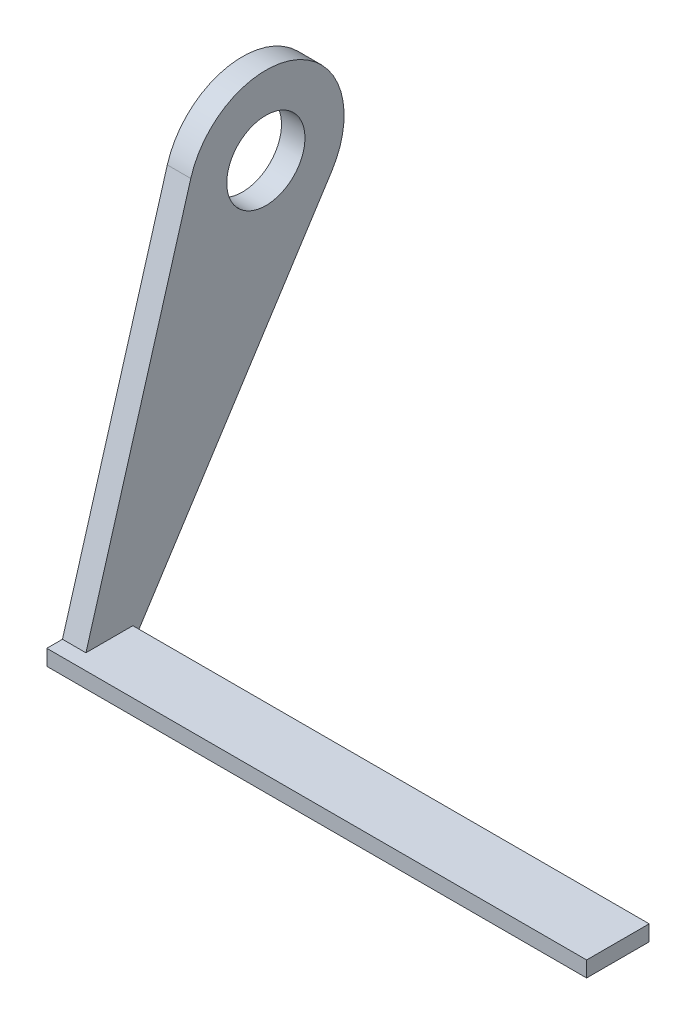
ISO-10303-21;
HEADER;
FILE_DESCRIPTION(('STEP AP214'),'2;1');
FILE_NAME('part.step','',(''),(''),'','','');
FILE_SCHEMA(('AUTOMOTIVE_DESIGN { 1 0 10303 214 1 1 1 1 }'));
ENDSEC;
DATA;
#1=APPLICATION_CONTEXT('core data for automotive mechanical design processes');
#2=APPLICATION_PROTOCOL_DEFINITION('international standard','automotive_design',2000,#1);
#3=PRODUCT_CONTEXT('',#1,'mechanical');
#4=PRODUCT('Part','Part','',(#3));
#5=PRODUCT_RELATED_PRODUCT_CATEGORY('part','',(#4));
#6=PRODUCT_DEFINITION_FORMATION('','',#4);
#7=PRODUCT_DEFINITION_CONTEXT('part definition',#1,'design');
#8=PRODUCT_DEFINITION('design','',#6,#7);
#9=PRODUCT_DEFINITION_SHAPE('','',#8);
#10=(LENGTH_UNIT() NAMED_UNIT(*) SI_UNIT(.MILLI.,.METRE.));
#11=(NAMED_UNIT(*) PLANE_ANGLE_UNIT() SI_UNIT($,.RADIAN.));
#12=(NAMED_UNIT(*) SI_UNIT($,.STERADIAN.) SOLID_ANGLE_UNIT());
#13=UNCERTAINTY_MEASURE_WITH_UNIT(LENGTH_MEASURE(1.E-05),#10,'distance_accuracy_value','');
#14=(GEOMETRIC_REPRESENTATION_CONTEXT(3) GLOBAL_UNCERTAINTY_ASSIGNED_CONTEXT((#13)) GLOBAL_UNIT_ASSIGNED_CONTEXT((#10,
#11,#12)) REPRESENTATION_CONTEXT('',''));
#15=CARTESIAN_POINT('',(0.,0.,0.));
#16=DIRECTION('',(0.,0.,1.));
#17=DIRECTION('',(1.,0.,0.));
#18=AXIS2_PLACEMENT_3D('',#15,#16,#17);
#19=CARTESIAN_POINT('',(17.526,-10.922,0.));
#20=DIRECTION('',(0.,1.,0.));
#21=DIRECTION('',(0.,0.,1.));
#22=AXIS2_PLACEMENT_3D('',#19,#20,#21);
#23=PLANE('',#22);
#24=DIRECTION('',(0.,0.,-1.));
#25=VECTOR('',#24,1.);
#26=CARTESIAN_POINT('',(0.762,-10.922,0.));
#27=LINE('',#26,#25);
#28=CARTESIAN_POINT('',(0.762,-10.922,5.842));
#29=VERTEX_POINT('',#28);
#30=CARTESIAN_POINT('',(0.762,-10.922,4.318));
#31=VERTEX_POINT('',#30);
#32=EDGE_CURVE('E135',#29,#31,#27,.T.);
#33=ORIENTED_EDGE('',*,*,#32,.F.);
#34=DIRECTION('',(-1.,0.,0.));
#35=VECTOR('',#34,1.);
#36=CARTESIAN_POINT('',(0.762,-10.922,5.842));
#37=LINE('',#36,#35);
#38=CARTESIAN_POINT('',(0.,-10.922,5.842));
#39=VERTEX_POINT('',#38);
#40=EDGE_CURVE('E147',#29,#39,#37,.T.);
#41=ORIENTED_EDGE('',*,*,#40,.T.);
#42=DIRECTION('',(0.,0.,-1.));
#43=VECTOR('',#42,1.);
#44=CARTESIAN_POINT('',(0.,-10.922,0.));
#45=LINE('',#44,#43);
#46=CARTESIAN_POINT('',(0.,-10.922,6.35));
#47=VERTEX_POINT('',#46);
#48=EDGE_CURVE('E114',#47,#39,#45,.T.);
#49=ORIENTED_EDGE('',*,*,#48,.F.);
#50=DIRECTION('',(-1.,0.,0.));
#51=VECTOR('',#50,1.);
#52=CARTESIAN_POINT('',(17.526,-10.922,6.35));
#53=LINE('',#52,#51);
#54=CARTESIAN_POINT('',(17.526,-10.922,6.35));
#55=VERTEX_POINT('',#54);
#56=EDGE_CURVE('E44',#55,#47,#53,.T.);
#57=ORIENTED_EDGE('',*,*,#56,.F.);
#58=DIRECTION('',(0.,0.,-1.));
#59=VECTOR('',#58,1.);
#60=CARTESIAN_POINT('',(17.526,-10.922,0.));
#61=LINE('',#60,#59);
#62=CARTESIAN_POINT('',(17.526,-10.922,4.318));
#63=VERTEX_POINT('',#62);
#64=EDGE_CURVE('E153',#55,#63,#61,.T.);
#65=ORIENTED_EDGE('',*,*,#64,.T.);
#66=DIRECTION('',(-1.,0.,0.));
#67=VECTOR('',#66,1.);
#68=CARTESIAN_POINT('',(17.526,-10.922,4.318));
#69=LINE('',#68,#67);
#70=EDGE_CURVE('E11',#63,#31,#69,.T.);
#71=ORIENTED_EDGE('',*,*,#70,.T.);
#72=EDGE_LOOP('',(#33,#41,#49,#57,#65,#71));
#73=FACE_BOUND('',#72,.T.);
#74=ADVANCED_FACE('F35',(#73),#23,.T.);
#75=CARTESIAN_POINT('',(17.526,0.,4.318));
#76=DIRECTION('',(0.,0.,-1.));
#77=DIRECTION('',(-1.,0.,0.));
#78=AXIS2_PLACEMENT_3D('',#75,#76,#77);
#79=PLANE('',#78);
#80=DIRECTION('',(0.,-1.,0.));
#81=VECTOR('',#80,1.);
#82=CARTESIAN_POINT('',(0.762,0.,4.318));
#83=LINE('',#82,#81);
#84=CARTESIAN_POINT('',(0.762,-11.43,4.318));
#85=VERTEX_POINT('',#84);
#86=EDGE_CURVE('E127',#31,#85,#83,.T.);
#87=ORIENTED_EDGE('',*,*,#86,.F.);
#88=ORIENTED_EDGE('',*,*,#70,.F.);
#89=DIRECTION('',(0.,-1.,0.));
#90=VECTOR('',#89,1.);
#91=CARTESIAN_POINT('',(17.526,0.,4.318));
#92=LINE('',#91,#90);
#93=CARTESIAN_POINT('',(17.526,-11.43,4.318));
#94=VERTEX_POINT('',#93);
#95=EDGE_CURVE('E151',#63,#94,#92,.T.);
#96=ORIENTED_EDGE('',*,*,#95,.T.);
#97=DIRECTION('',(-1.,0.,0.));
#98=VECTOR('',#97,1.);
#99=CARTESIAN_POINT('',(17.526,-11.43,4.318));
#100=LINE('',#99,#98);
#101=EDGE_CURVE('E160',#94,#85,#100,.T.);
#102=ORIENTED_EDGE('',*,*,#101,.T.);
#103=EDGE_LOOP('',(#87,#88,#96,#102));
#104=FACE_BOUND('',#103,.T.);
#105=ADVANCED_FACE('F37',(#104),#79,.T.);
#106=CARTESIAN_POINT('',(17.526,0.,6.35));
#107=DIRECTION('',(0.,0.,-1.));
#108=DIRECTION('',(-1.,0.,0.));
#109=AXIS2_PLACEMENT_3D('',#106,#107,#108);
#110=PLANE('',#109);
#111=DIRECTION('',(0.,-1.,0.));
#112=VECTOR('',#111,1.);
#113=CARTESIAN_POINT('',(0.,0.,6.35));
#114=LINE('',#113,#112);
#115=CARTESIAN_POINT('',(0.,-11.43,6.35));
#116=VERTEX_POINT('',#115);
#117=EDGE_CURVE('E66',#47,#116,#114,.T.);
#118=ORIENTED_EDGE('',*,*,#117,.T.);
#119=DIRECTION('',(-1.,0.,0.));
#120=VECTOR('',#119,1.);
#121=CARTESIAN_POINT('',(17.526,-11.43,6.35));
#122=LINE('',#121,#120);
#123=CARTESIAN_POINT('',(17.526,-11.43,6.35));
#124=VERTEX_POINT('',#123);
#125=EDGE_CURVE('E168',#124,#116,#122,.T.);
#126=ORIENTED_EDGE('',*,*,#125,.F.);
#127=DIRECTION('',(0.,-1.,0.));
#128=VECTOR('',#127,1.);
#129=CARTESIAN_POINT('',(17.526,0.,6.35));
#130=LINE('',#129,#128);
#131=EDGE_CURVE('E157',#55,#124,#130,.T.);
#132=ORIENTED_EDGE('',*,*,#131,.F.);
#133=ORIENTED_EDGE('',*,*,#56,.T.);
#134=EDGE_LOOP('',(#118,#126,#132,#133));
#135=FACE_BOUND('',#134,.T.);
#136=ADVANCED_FACE('F170',(#135),#110,.F.);
#137=CARTESIAN_POINT('',(17.526,-11.43,0.));
#138=DIRECTION('',(0.,1.,0.));
#139=DIRECTION('',(0.,0.,1.));
#140=AXIS2_PLACEMENT_3D('',#137,#138,#139);
#141=PLANE('',#140);
#142=DIRECTION('',(0.,0.,-1.));
#143=VECTOR('',#142,1.);
#144=CARTESIAN_POINT('',(0.,-11.43,0.));
#145=LINE('',#144,#143);
#146=CARTESIAN_POINT('',(0.,-11.43,4.318));
#147=VERTEX_POINT('',#146);
#148=EDGE_CURVE('E154',#116,#147,#145,.T.);
#149=ORIENTED_EDGE('',*,*,#148,.T.);
#150=DIRECTION('',(-1.,0.,0.));
#151=VECTOR('',#150,1.);
#152=CARTESIAN_POINT('',(0.762,-11.43,4.318));
#153=LINE('',#152,#151);
#154=EDGE_CURVE('E141',#85,#147,#153,.T.);
#155=ORIENTED_EDGE('',*,*,#154,.F.);
#156=ORIENTED_EDGE('',*,*,#101,.F.);
#157=DIRECTION('',(0.,0.,-1.));
#158=VECTOR('',#157,1.);
#159=CARTESIAN_POINT('',(17.526,-11.43,0.));
#160=LINE('',#159,#158);
#161=EDGE_CURVE('E52',#124,#94,#160,.T.);
#162=ORIENTED_EDGE('',*,*,#161,.F.);
#163=ORIENTED_EDGE('',*,*,#125,.T.);
#164=EDGE_LOOP('',(#149,#155,#156,#162,#163));
#165=FACE_BOUND('',#164,.T.);
#166=ADVANCED_FACE('F183',(#165),#141,.F.);
#167=CARTESIAN_POINT('',(17.526,0.,0.));
#168=DIRECTION('',(1.,0.,0.));
#169=DIRECTION('',(0.,0.,-1.));
#170=AXIS2_PLACEMENT_3D('',#167,#168,#169);
#171=PLANE('',#170);
#172=ORIENTED_EDGE('',*,*,#95,.F.);
#173=ORIENTED_EDGE('',*,*,#64,.F.);
#174=ORIENTED_EDGE('',*,*,#131,.T.);
#175=ORIENTED_EDGE('',*,*,#161,.T.);
#176=EDGE_LOOP('',(#172,#173,#174,#175));
#177=FACE_BOUND('',#176,.T.);
#178=ADVANCED_FACE('F181',(#177),#171,.T.);
#179=CARTESIAN_POINT('',(0.,0.,0.));
#180=DIRECTION('',(1.,0.,0.));
#181=DIRECTION('',(0.,0.,-1.));
#182=AXIS2_PLACEMENT_3D('',#179,#180,#181);
#183=PLANE('',#182);
#184=ORIENTED_EDGE('',*,*,#48,.T.);
#185=DIRECTION('',(0.,-0.959764981064111,0.280804524755222));
#186=VECTOR('',#185,1.);
#187=CARTESIAN_POINT('',(0.,0.713243492878265,2.43780305190284));
#188=LINE('',#187,#186);
#189=CARTESIAN_POINT('',(0.,0.713243492878265,2.43780305190284));
#190=VERTEX_POINT('',#189);
#191=EDGE_CURVE('E131',#190,#39,#188,.T.);
#192=ORIENTED_EDGE('',*,*,#191,.F.);
#193=CARTESIAN_POINT('',(0.,0.,0.));
#194=DIRECTION('',(1.,0.,0.));
#195=DIRECTION('',(0.,0.,-1.));
#196=AXIS2_PLACEMENT_3D('',#193,#194,#195);
#197=CIRCLE('',#196,2.54);
#198=CARTESIAN_POINT('',(0.,-1.37197731646134,-2.13758701416236));
#199=VERTEX_POINT('',#198);
#200=EDGE_CURVE('E143',#199,#190,#197,.T.);
#201=ORIENTED_EDGE('',*,*,#200,.F.);
#202=DIRECTION('',(0.,-0.841569690615102,0.540148549787927));
#203=VECTOR('',#202,1.);
#204=CARTESIAN_POINT('',(0.,-1.37197731646134,-2.13758701416236));
#205=LINE('',#204,#203);
#206=EDGE_CURVE('E74',#199,#147,#205,.T.);
#207=ORIENTED_EDGE('',*,*,#206,.T.);
#208=ORIENTED_EDGE('',*,*,#148,.F.);
#209=ORIENTED_EDGE('',*,*,#117,.F.);
#210=EDGE_LOOP('',(#184,#192,#201,#207,#208,#209));
#211=FACE_BOUND('',#210,.T.);
#212=CARTESIAN_POINT('',(0.,0.,0.));
#213=DIRECTION('',(1.,0.,0.));
#214=DIRECTION('',(0.,0.,-1.));
#215=AXIS2_PLACEMENT_3D('',#212,#213,#214);
#216=CIRCLE('',#215,1.27);
#217=CARTESIAN_POINT('',(0.,0.,1.27));
#218=VERTEX_POINT('',#217);
#219=EDGE_CURVE('E128',#218,#218,#216,.T.);
#220=ORIENTED_EDGE('',*,*,#219,.T.);
#221=EDGE_LOOP('',(#220));
#222=FACE_BOUND('',#221,.T.);
#223=ADVANCED_FACE('F174',(#211,#222),#183,.F.);
#224=CARTESIAN_POINT('',(0.762,-1.37197731646134,-2.13758701416236));
#225=DIRECTION('',(0.,-0.540148549787927,-0.841569690615102));
#226=DIRECTION('',(0.,0.841569690615102,-0.540148549787927));
#227=AXIS2_PLACEMENT_3D('',#224,#225,#226);
#228=PLANE('',#227);
#229=ORIENTED_EDGE('',*,*,#206,.F.);
#230=DIRECTION('',(-1.,0.,0.));
#231=VECTOR('',#230,1.);
#232=CARTESIAN_POINT('',(0.762,-1.37197731646134,-2.13758701416236));
#233=LINE('',#232,#231);
#234=CARTESIAN_POINT('',(0.762,-1.37197731646134,-2.13758701416236));
#235=VERTEX_POINT('',#234);
#236=EDGE_CURVE('E107',#235,#199,#233,.T.);
#237=ORIENTED_EDGE('',*,*,#236,.F.);
#238=DIRECTION('',(0.,-0.841569690615102,0.540148549787927));
#239=VECTOR('',#238,1.);
#240=CARTESIAN_POINT('',(0.762,-1.37197731646134,-2.13758701416236));
#241=LINE('',#240,#239);
#242=EDGE_CURVE('E111',#235,#85,#241,.T.);
#243=ORIENTED_EDGE('',*,*,#242,.T.);
#244=ORIENTED_EDGE('',*,*,#154,.T.);
#245=EDGE_LOOP('',(#229,#237,#243,#244));
#246=FACE_BOUND('',#245,.T.);
#247=ADVANCED_FACE('F109',(#246),#228,.T.);
#248=CARTESIAN_POINT('',(0.762,0.,0.));
#249=DIRECTION('',(-1.,0.,0.));
#250=DIRECTION('',(0.,0.,1.));
#251=AXIS2_PLACEMENT_3D('',#248,#249,#250);
#252=CYLINDRICAL_SURFACE('',#251,2.54);
#253=ORIENTED_EDGE('',*,*,#200,.T.);
#254=DIRECTION('',(-1.,0.,0.));
#255=VECTOR('',#254,1.);
#256=CARTESIAN_POINT('',(0.762,0.713243492878265,2.43780305190284));
#257=LINE('',#256,#255);
#258=CARTESIAN_POINT('',(0.762,0.713243492878265,2.43780305190284));
#259=VERTEX_POINT('',#258);
#260=EDGE_CURVE('E115',#259,#190,#257,.T.);
#261=ORIENTED_EDGE('',*,*,#260,.F.);
#262=CARTESIAN_POINT('',(0.762,0.,0.));
#263=DIRECTION('',(1.,0.,0.));
#264=DIRECTION('',(0.,0.,-1.));
#265=AXIS2_PLACEMENT_3D('',#262,#263,#264);
#266=CIRCLE('',#265,2.54);
#267=EDGE_CURVE('E118',#235,#259,#266,.T.);
#268=ORIENTED_EDGE('',*,*,#267,.F.);
#269=ORIENTED_EDGE('',*,*,#236,.T.);
#270=EDGE_LOOP('',(#253,#261,#268,#269));
#271=FACE_BOUND('',#270,.T.);
#272=ADVANCED_FACE('F119',(#271),#252,.T.);
#273=CARTESIAN_POINT('',(0.762,0.713243492878265,2.43780305190284));
#274=DIRECTION('',(0.,-0.280804524755222,-0.959764981064111));
#275=DIRECTION('',(0.,0.959764981064111,-0.280804524755222));
#276=AXIS2_PLACEMENT_3D('',#273,#274,#275);
#277=PLANE('',#276);
#278=ORIENTED_EDGE('',*,*,#191,.T.);
#279=ORIENTED_EDGE('',*,*,#40,.F.);
#280=DIRECTION('',(0.,-0.959764981064111,0.280804524755222));
#281=VECTOR('',#280,1.);
#282=CARTESIAN_POINT('',(0.762,0.713243492878265,2.43780305190284));
#283=LINE('',#282,#281);
#284=EDGE_CURVE('E123',#259,#29,#283,.T.);
#285=ORIENTED_EDGE('',*,*,#284,.F.);
#286=ORIENTED_EDGE('',*,*,#260,.T.);
#287=EDGE_LOOP('',(#278,#279,#285,#286));
#288=FACE_BOUND('',#287,.T.);
#289=ADVANCED_FACE('F180',(#288),#277,.F.);
#290=CARTESIAN_POINT('',(0.762,0.,0.));
#291=DIRECTION('',(-1.,0.,0.));
#292=DIRECTION('',(0.,0.,1.));
#293=AXIS2_PLACEMENT_3D('',#290,#291,#292);
#294=CYLINDRICAL_SURFACE('',#293,1.27);
#295=CARTESIAN_POINT('',(0.762,0.,0.));
#296=DIRECTION('',(1.,0.,0.));
#297=DIRECTION('',(0.,0.,-1.));
#298=AXIS2_PLACEMENT_3D('',#295,#296,#297);
#299=CIRCLE('',#298,1.27);
#300=CARTESIAN_POINT('',(0.762,0.,1.27));
#301=VERTEX_POINT('',#300);
#302=EDGE_CURVE('E138',#301,#301,#299,.T.);
#303=CARTESIAN_POINT('',(0.762,0.,1.27));
#304=CARTESIAN_POINT('',(0.7540625,0.,1.27));
#305=CARTESIAN_POINT('',(0.746125,0.,1.27));
#306=CARTESIAN_POINT('',(0.73025,0.,1.27));
#307=CARTESIAN_POINT('',(0.7223125,0.,1.27));
#308=CARTESIAN_POINT('',(0.7064375,0.,1.27));
#309=CARTESIAN_POINT('',(0.6985,0.,1.27));
#310=CARTESIAN_POINT('',(0.682625,0.,1.27));
#311=CARTESIAN_POINT('',(0.6746875,0.,1.27));
#312=CARTESIAN_POINT('',(0.6588125,0.,1.27));
#313=CARTESIAN_POINT('',(0.650875,0.,1.27));
#314=CARTESIAN_POINT('',(0.635,0.,1.27));
#315=CARTESIAN_POINT('',(0.6270625,0.,1.27));
#316=CARTESIAN_POINT('',(0.6111875,0.,1.27));
#317=CARTESIAN_POINT('',(0.60325,0.,1.27));
#318=CARTESIAN_POINT('',(0.587375,0.,1.27));
#319=CARTESIAN_POINT('',(0.5794375,0.,1.27));
#320=CARTESIAN_POINT('',(0.5635625,0.,1.27));
#321=CARTESIAN_POINT('',(0.555625,0.,1.27));
#322=CARTESIAN_POINT('',(0.53975,0.,1.27));
#323=CARTESIAN_POINT('',(0.5318125,0.,1.27));
#324=CARTESIAN_POINT('',(0.5159375,0.,1.27));
#325=CARTESIAN_POINT('',(0.508,0.,1.27));
#326=CARTESIAN_POINT('',(0.492125,0.,1.27));
#327=CARTESIAN_POINT('',(0.4841875,0.,1.27));
#328=CARTESIAN_POINT('',(0.4683125,0.,1.27));
#329=CARTESIAN_POINT('',(0.460375,0.,1.27));
#330=CARTESIAN_POINT('',(0.4445,0.,1.27));
#331=CARTESIAN_POINT('',(0.4365625,0.,1.27));
#332=CARTESIAN_POINT('',(0.4206875,0.,1.27));
#333=CARTESIAN_POINT('',(0.41275,0.,1.27));
#334=CARTESIAN_POINT('',(0.396875,0.,1.27));
#335=CARTESIAN_POINT('',(0.3889375,0.,1.27));
#336=CARTESIAN_POINT('',(0.3730625,0.,1.27));
#337=CARTESIAN_POINT('',(0.365125,0.,1.27));
#338=CARTESIAN_POINT('',(0.34925,0.,1.27));
#339=CARTESIAN_POINT('',(0.3413125,0.,1.27));
#340=CARTESIAN_POINT('',(0.3254375,0.,1.27));
#341=CARTESIAN_POINT('',(0.3175,0.,1.27));
#342=CARTESIAN_POINT('',(0.301625,0.,1.27));
#343=CARTESIAN_POINT('',(0.2936875,0.,1.27));
#344=CARTESIAN_POINT('',(0.2778125,0.,1.27));
#345=CARTESIAN_POINT('',(0.269875,0.,1.27));
#346=CARTESIAN_POINT('',(0.254,0.,1.27));
#347=CARTESIAN_POINT('',(0.2460625,0.,1.27));
#348=CARTESIAN_POINT('',(0.2301875,0.,1.27));
#349=CARTESIAN_POINT('',(0.22225,0.,1.27));
#350=CARTESIAN_POINT('',(0.206375,0.,1.27));
#351=CARTESIAN_POINT('',(0.1984375,0.,1.27));
#352=CARTESIAN_POINT('',(0.1825625,0.,1.27));
#353=CARTESIAN_POINT('',(0.174625,0.,1.27));
#354=CARTESIAN_POINT('',(0.15875,0.,1.27));
#355=CARTESIAN_POINT('',(0.1508125,0.,1.27));
#356=CARTESIAN_POINT('',(0.1349375,0.,1.27));
#357=CARTESIAN_POINT('',(0.127,0.,1.27));
#358=CARTESIAN_POINT('',(0.111125,0.,1.27));
#359=CARTESIAN_POINT('',(0.1031875,0.,1.27));
#360=CARTESIAN_POINT('',(0.0873125,0.,1.27));
#361=CARTESIAN_POINT('',(0.079375,0.,1.27));
#362=CARTESIAN_POINT('',(0.0635,0.,1.27));
#363=CARTESIAN_POINT('',(0.0555625,0.,1.27));
#364=CARTESIAN_POINT('',(0.0396875,0.,1.27));
#365=CARTESIAN_POINT('',(0.03175,0.,1.27));
#366=CARTESIAN_POINT('',(0.015875,0.,1.27));
#367=CARTESIAN_POINT('',(0.00793749999999999,0.,1.27));
#368=CARTESIAN_POINT('',(0.,0.,1.27));
#369=B_SPLINE_CURVE_WITH_KNOTS('',3,(#303,#304,#305,#306,#307,#308,#309,#310,#311,#312,#313,
#314,#315,#316,#317,#318,#319,#320,#321,#322,#323,#324,#325,#326,#327,#328,#329,#330,#331,#332,
#333,#334,#335,#336,#337,#338,#339,#340,#341,#342,#343,#344,#345,#346,#347,#348,#349,#350,#351,
#352,#353,#354,#355,#356,#357,#358,#359,#360,#361,#362,#363,#364,#365,#366,#367,#368),
.UNSPECIFIED.,.F.,.F.,(4,2,2,2,2,2,2,2,2,2,2,2,2,2,2,2,2,2,2,2,2,2,2,2,2,2,2,2,2,2,2,2,4),(0.,
0.0238125000000001,0.047625,0.0714375,0.0952500000000001,0.1190625,0.142875,0.1666875,0.1905,
0.2143125,0.238125,0.2619375,0.28575,0.3095625,0.333375,0.3571875,0.381,0.4048125,0.428625,
0.4524375,0.47625,0.5000625,0.523875,0.5476875,0.5715,0.5953125,0.619125,0.6429375,0.66675,
0.6905625,0.714375,0.7381875,0.762),.UNSPECIFIED.);
#370=EDGE_CURVE('BSEAM250',#301,#218,#369,.T.);
#371=ORIENTED_EDGE('',*,*,#302,.T.);
#372=ORIENTED_EDGE('',*,*,#219,.F.);
#373=ORIENTED_EDGE('',*,*,#370,.T.);
#374=ORIENTED_EDGE('',*,*,#370,.F.);
#375=EDGE_LOOP('',(#371,#373,#372,#374));
#376=FACE_BOUND('',#375,.T.);
#377=ADVANCED_FACE('F250',(#376),#294,.F.);
#378=CARTESIAN_POINT('',(0.762,0.,0.));
#379=DIRECTION('',(1.,0.,0.));
#380=DIRECTION('',(0.,0.,-1.));
#381=AXIS2_PLACEMENT_3D('',#378,#379,#380);
#382=PLANE('',#381);
#383=ORIENTED_EDGE('',*,*,#242,.F.);
#384=ORIENTED_EDGE('',*,*,#267,.T.);
#385=ORIENTED_EDGE('',*,*,#284,.T.);
#386=ORIENTED_EDGE('',*,*,#32,.T.);
#387=ORIENTED_EDGE('',*,*,#86,.T.);
#388=EDGE_LOOP('',(#383,#384,#385,#386,#387));
#389=FACE_BOUND('',#388,.T.);
#390=ORIENTED_EDGE('',*,*,#302,.F.);
#391=EDGE_LOOP('',(#390));
#392=FACE_BOUND('',#391,.T.);
#393=ADVANCED_FACE('F125',(#389,#392),#382,.T.);
#394=CLOSED_SHELL('',(#74,#105,#136,#166,#178,#223,#247,#272,#289,#377,#393));
#395=MANIFOLD_SOLID_BREP('B2',#394);
#396=ADVANCED_BREP_SHAPE_REPRESENTATION('',(#18,#395),#14);
#397=SHAPE_DEFINITION_REPRESENTATION(#9,#396);
ENDSEC;
END-ISO-10303-21;
